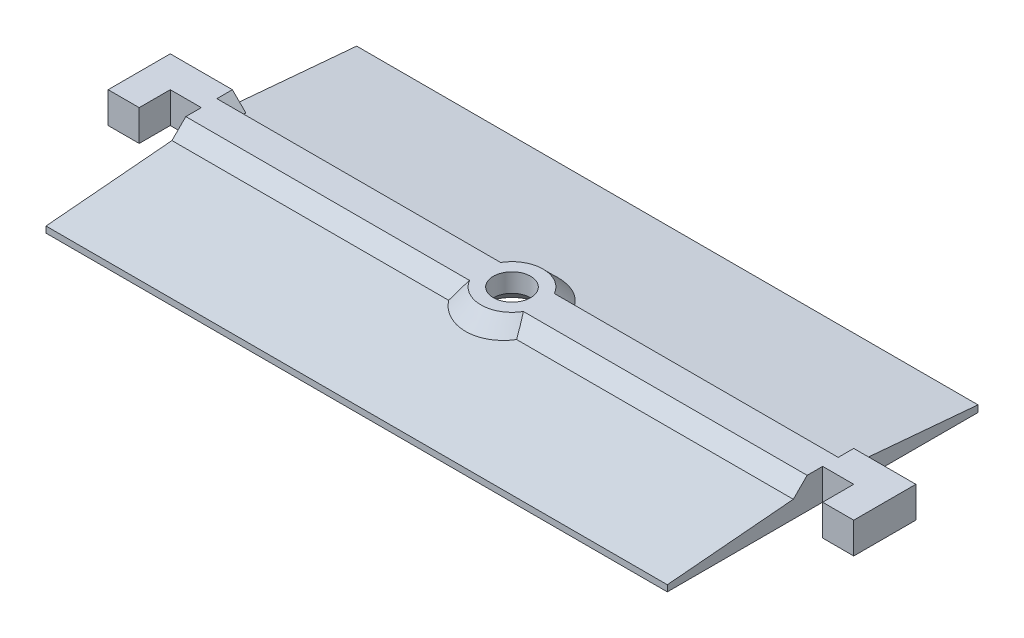
ISO-10303-21;
HEADER;
FILE_DESCRIPTION(('STEP AP214'),'2;1');
FILE_NAME('part.step','',(''),(''),'','','');
FILE_SCHEMA(('AUTOMOTIVE_DESIGN { 1 0 10303 214 1 1 1 1 }'));
ENDSEC;
DATA;
#1=APPLICATION_CONTEXT('core data for automotive mechanical design processes');
#2=APPLICATION_PROTOCOL_DEFINITION('international standard','automotive_design',2000,#1);
#3=PRODUCT_CONTEXT('',#1,'mechanical');
#4=PRODUCT('Part','Part','',(#3));
#5=PRODUCT_RELATED_PRODUCT_CATEGORY('part','',(#4));
#6=PRODUCT_DEFINITION_FORMATION('','',#4);
#7=PRODUCT_DEFINITION_CONTEXT('part definition',#1,'design');
#8=PRODUCT_DEFINITION('design','',#6,#7);
#9=PRODUCT_DEFINITION_SHAPE('','',#8);
#10=(LENGTH_UNIT() NAMED_UNIT(*) SI_UNIT(.MILLI.,.METRE.));
#11=(NAMED_UNIT(*) PLANE_ANGLE_UNIT() SI_UNIT($,.RADIAN.));
#12=(NAMED_UNIT(*) SI_UNIT($,.STERADIAN.) SOLID_ANGLE_UNIT());
#13=UNCERTAINTY_MEASURE_WITH_UNIT(LENGTH_MEASURE(1.E-05),#10,'distance_accuracy_value','');
#14=(GEOMETRIC_REPRESENTATION_CONTEXT(3) GLOBAL_UNCERTAINTY_ASSIGNED_CONTEXT((#13)) GLOBAL_UNIT_ASSIGNED_CONTEXT((#10,
#11,#12)) REPRESENTATION_CONTEXT('',''));
#15=CARTESIAN_POINT('',(0.,0.,0.));
#16=DIRECTION('',(0.,0.,1.));
#17=DIRECTION('',(1.,0.,0.));
#18=AXIS2_PLACEMENT_3D('',#15,#16,#17);
#19=CARTESIAN_POINT('',(-50.,3.,0.));
#20=DIRECTION('',(-1.,0.,0.));
#21=DIRECTION('',(0.,0.,1.));
#22=AXIS2_PLACEMENT_3D('',#19,#20,#21);
#23=PLANE('',#22);
#24=DIRECTION('',(0.,0.0871557427476554,-0.996194698091746));
#25=VECTOR('',#24,1.);
#26=CARTESIAN_POINT('',(-50.,3.18579446782419,0.0162549096804485));
#27=LINE('',#26,#25);
#28=CARTESIAN_POINT('',(-50.,0.99999999999984,25.));
#29=VERTEX_POINT('',#28);
#30=CARTESIAN_POINT('',(-50.,2.77372073149621,4.72627926850375));
#31=VERTEX_POINT('',#30);
#32=EDGE_CURVE('E547',#29,#31,#27,.T.);
#33=ORIENTED_EDGE('',*,*,#32,.T.);
#34=DIRECTION('',(0.,0.707106781186552,-0.707106781186543));
#35=VECTOR('',#34,1.);
#36=CARTESIAN_POINT('',(-50.,4.99999999999999,2.49999999999999));
#37=LINE('',#36,#35);
#38=CARTESIAN_POINT('',(-50.,5.,2.49999999999999));
#39=VERTEX_POINT('',#38);
#40=EDGE_CURVE('E439',#31,#39,#37,.T.);
#41=ORIENTED_EDGE('',*,*,#40,.T.);
#42=DIRECTION('',(0.,0.,-1.));
#43=VECTOR('',#42,1.);
#44=CARTESIAN_POINT('',(-50.,5.,0.));
#45=LINE('',#44,#43);
#46=CARTESIAN_POINT('',(-50.,5.,0.));
#47=VERTEX_POINT('',#46);
#48=EDGE_CURVE('E390',#39,#47,#45,.T.);
#49=ORIENTED_EDGE('',*,*,#48,.T.);
#50=DIRECTION('',(0.,-1.,0.));
#51=VECTOR('',#50,1.);
#52=CARTESIAN_POINT('',(-50.,5.,0.));
#53=LINE('',#52,#51);
#54=CARTESIAN_POINT('',(-50.,0.,0.));
#55=VERTEX_POINT('',#54);
#56=EDGE_CURVE('E395',#47,#55,#53,.T.);
#57=ORIENTED_EDGE('',*,*,#56,.T.);
#58=DIRECTION('',(0.,0.,-1.));
#59=VECTOR('',#58,1.);
#60=CARTESIAN_POINT('',(-50.,0.,0.));
#61=LINE('',#60,#59);
#62=CARTESIAN_POINT('',(-50.,0.,25.));
#63=VERTEX_POINT('',#62);
#64=EDGE_CURVE('E367',#63,#55,#61,.T.);
#65=ORIENTED_EDGE('',*,*,#64,.F.);
#66=DIRECTION('',(0.,-1.,0.));
#67=VECTOR('',#66,1.);
#68=CARTESIAN_POINT('',(-50.,3.,25.));
#69=LINE('',#68,#67);
#70=EDGE_CURVE('E431',#29,#63,#69,.T.);
#71=ORIENTED_EDGE('',*,*,#70,.F.);
#72=EDGE_LOOP('',(#33,#41,#49,#57,#65,#71));
#73=FACE_BOUND('',#72,.T.);
#74=ADVANCED_FACE('F105',(#73),#23,.T.);
#75=CARTESIAN_POINT('',(0.,3.,25.));
#76=DIRECTION('',(0.,0.,-1.));
#77=DIRECTION('',(-1.,0.,0.));
#78=AXIS2_PLACEMENT_3D('',#75,#76,#77);
#79=PLANE('',#78);
#80=DIRECTION('',(0.,-1.,0.));
#81=VECTOR('',#80,1.);
#82=CARTESIAN_POINT('',(50.,3.,25.));
#83=LINE('',#82,#81);
#84=CARTESIAN_POINT('',(50.,0.99999999999984,25.));
#85=VERTEX_POINT('',#84);
#86=CARTESIAN_POINT('',(50.,0.,25.));
#87=VERTEX_POINT('',#86);
#88=EDGE_CURVE('E429',#85,#87,#83,.T.);
#89=ORIENTED_EDGE('',*,*,#88,.F.);
#90=DIRECTION('',(-1.,0.,0.));
#91=VECTOR('',#90,1.);
#92=CARTESIAN_POINT('',(-50.,0.99999999999984,25.));
#93=LINE('',#92,#91);
#94=EDGE_CURVE('E544',#85,#29,#93,.T.);
#95=ORIENTED_EDGE('',*,*,#94,.T.);
#96=ORIENTED_EDGE('',*,*,#70,.T.);
#97=DIRECTION('',(1.,0.,0.));
#98=VECTOR('',#97,1.);
#99=CARTESIAN_POINT('',(0.,0.,25.));
#100=LINE('',#99,#98);
#101=EDGE_CURVE('E424',#63,#87,#100,.T.);
#102=ORIENTED_EDGE('',*,*,#101,.T.);
#103=EDGE_LOOP('',(#89,#95,#96,#102));
#104=FACE_BOUND('',#103,.T.);
#105=ADVANCED_FACE('F507',(#104),#79,.F.);
#106=CARTESIAN_POINT('',(50.,3.,0.));
#107=DIRECTION('',(-1.,0.,0.));
#108=DIRECTION('',(0.,0.,1.));
#109=AXIS2_PLACEMENT_3D('',#106,#107,#108);
#110=PLANE('',#109);
#111=DIRECTION('',(0.,-0.707106781186552,0.707106781186543));
#112=VECTOR('',#111,1.);
#113=CARTESIAN_POINT('',(50.,5.24999999999997,2.25));
#114=LINE('',#113,#112);
#115=CARTESIAN_POINT('',(50.,5.,2.49999999999998));
#116=VERTEX_POINT('',#115);
#117=CARTESIAN_POINT('',(50.,2.77372073149621,4.72627926850372));
#118=VERTEX_POINT('',#117);
#119=EDGE_CURVE('E437',#116,#118,#114,.T.);
#120=ORIENTED_EDGE('',*,*,#119,.T.);
#121=DIRECTION('',(0.,-0.0871557427476554,0.996194698091746));
#122=VECTOR('',#121,1.);
#123=CARTESIAN_POINT('',(50.,3.,2.13989539447477));
#124=LINE('',#123,#122);
#125=EDGE_CURVE('E539',#118,#85,#124,.T.);
#126=ORIENTED_EDGE('',*,*,#125,.T.);
#127=ORIENTED_EDGE('',*,*,#88,.T.);
#128=DIRECTION('',(0.,0.,-1.));
#129=VECTOR('',#128,1.);
#130=CARTESIAN_POINT('',(50.,0.,0.));
#131=LINE('',#130,#129);
#132=CARTESIAN_POINT('',(50.,0.,0.));
#133=VERTEX_POINT('',#132);
#134=EDGE_CURVE('E427',#87,#133,#131,.T.);
#135=ORIENTED_EDGE('',*,*,#134,.T.);
#136=DIRECTION('',(0.,-1.,0.));
#137=VECTOR('',#136,1.);
#138=CARTESIAN_POINT('',(50.,5.,0.));
#139=LINE('',#138,#137);
#140=CARTESIAN_POINT('',(50.,5.,0.));
#141=VERTEX_POINT('',#140);
#142=EDGE_CURVE('E341',#141,#133,#139,.T.);
#143=ORIENTED_EDGE('',*,*,#142,.F.);
#144=DIRECTION('',(0.,0.,-1.));
#145=VECTOR('',#144,1.);
#146=CARTESIAN_POINT('',(50.,5.,0.));
#147=LINE('',#146,#145);
#148=EDGE_CURVE('E339',#116,#141,#147,.T.);
#149=ORIENTED_EDGE('',*,*,#148,.F.);
#150=EDGE_LOOP('',(#120,#126,#127,#135,#143,#149));
#151=FACE_BOUND('',#150,.T.);
#152=ADVANCED_FACE('F513',(#151),#110,.F.);
#153=CARTESIAN_POINT('',(0.,0.,0.));
#154=DIRECTION('',(0.,1.,0.));
#155=DIRECTION('',(0.,0.,1.));
#156=AXIS2_PLACEMENT_3D('',#153,#154,#155);
#157=PLANE('',#156);
#158=CARTESIAN_POINT('',(0.,0.,0.));
#159=DIRECTION('',(0.,1.,0.));
#160=DIRECTION('',(0.,0.,1.));
#161=AXIS2_PLACEMENT_3D('',#158,#159,#160);
#162=CIRCLE('',#161,4.99999999999995);
#163=CARTESIAN_POINT('',(0.,0.,4.99999999999994));
#164=VERTEX_POINT('',#163);
#165=EDGE_CURVE('E113',#164,#164,#162,.T.);
#166=ORIENTED_EDGE('',*,*,#165,.T.);
#167=EDGE_LOOP('',(#166));
#168=FACE_BOUND('',#167,.T.);
#169=DIRECTION('',(0.,0.,-1.));
#170=VECTOR('',#169,1.);
#171=CARTESIAN_POINT('',(50.,0.,0.));
#172=LINE('',#171,#170);
#173=CARTESIAN_POINT('',(50.,0.,-5.00000000000001));
#174=VERTEX_POINT('',#173);
#175=CARTESIAN_POINT('',(50.,0.,-25.));
#176=VERTEX_POINT('',#175);
#177=EDGE_CURVE('E295',#174,#176,#172,.T.);
#178=ORIENTED_EDGE('',*,*,#177,.F.);
#179=DIRECTION('',(-1.,0.,0.));
#180=VECTOR('',#179,1.);
#181=CARTESIAN_POINT('',(0.,0.,-5.00000000000001));
#182=LINE('',#181,#180);
#183=CARTESIAN_POINT('',(60.,0.,-5.00000000000001));
#184=VERTEX_POINT('',#183);
#185=EDGE_CURVE('E321',#184,#174,#182,.T.);
#186=ORIENTED_EDGE('',*,*,#185,.F.);
#187=DIRECTION('',(0.,0.,-1.));
#188=VECTOR('',#187,1.);
#189=CARTESIAN_POINT('',(60.,0.,0.));
#190=LINE('',#189,#188);
#191=CARTESIAN_POINT('',(60.,0.,4.99999999999997));
#192=VERTEX_POINT('',#191);
#193=EDGE_CURVE('E350',#192,#184,#190,.T.);
#194=ORIENTED_EDGE('',*,*,#193,.F.);
#195=DIRECTION('',(1.,0.,0.));
#196=VECTOR('',#195,1.);
#197=CARTESIAN_POINT('',(0.,0.,4.99999999999996));
#198=LINE('',#197,#196);
#199=CARTESIAN_POINT('',(55.,0.,4.99999999999997));
#200=VERTEX_POINT('',#199);
#201=EDGE_CURVE('E348',#200,#192,#198,.T.);
#202=ORIENTED_EDGE('',*,*,#201,.F.);
#203=DIRECTION('',(0.,0.,1.));
#204=VECTOR('',#203,1.);
#205=CARTESIAN_POINT('',(55.,0.,0.));
#206=LINE('',#205,#204);
#207=CARTESIAN_POINT('',(55.,0.,0.));
#208=VERTEX_POINT('',#207);
#209=EDGE_CURVE('E345',#208,#200,#206,.T.);
#210=ORIENTED_EDGE('',*,*,#209,.F.);
#211=DIRECTION('',(1.,0.,0.));
#212=VECTOR('',#211,1.);
#213=CARTESIAN_POINT('',(0.,0.,0.));
#214=LINE('',#213,#212);
#215=EDGE_CURVE('E342',#133,#208,#214,.T.);
#216=ORIENTED_EDGE('',*,*,#215,.F.);
#217=ORIENTED_EDGE('',*,*,#134,.F.);
#218=ORIENTED_EDGE('',*,*,#101,.F.);
#219=ORIENTED_EDGE('',*,*,#64,.T.);
#220=DIRECTION('',(-1.,0.,0.));
#221=VECTOR('',#220,1.);
#222=CARTESIAN_POINT('',(0.,0.,0.));
#223=LINE('',#222,#221);
#224=CARTESIAN_POINT('',(-55.,0.,0.));
#225=VERTEX_POINT('',#224);
#226=EDGE_CURVE('E372',#55,#225,#223,.T.);
#227=ORIENTED_EDGE('',*,*,#226,.T.);
#228=DIRECTION('',(0.,0.,1.));
#229=VECTOR('',#228,1.);
#230=CARTESIAN_POINT('',(-55.,0.,0.));
#231=LINE('',#230,#229);
#232=CARTESIAN_POINT('',(-55.,0.,5.));
#233=VERTEX_POINT('',#232);
#234=EDGE_CURVE('E405',#225,#233,#231,.T.);
#235=ORIENTED_EDGE('',*,*,#234,.T.);
#236=DIRECTION('',(-1.,0.,0.));
#237=VECTOR('',#236,1.);
#238=CARTESIAN_POINT('',(0.,0.,4.99999999999999));
#239=LINE('',#238,#237);
#240=CARTESIAN_POINT('',(-60.,0.,5.));
#241=VERTEX_POINT('',#240);
#242=EDGE_CURVE('E402',#233,#241,#239,.T.);
#243=ORIENTED_EDGE('',*,*,#242,.T.);
#244=DIRECTION('',(0.,0.,-1.));
#245=VECTOR('',#244,1.);
#246=CARTESIAN_POINT('',(-60.,0.,0.));
#247=LINE('',#246,#245);
#248=CARTESIAN_POINT('',(-60.,0.,-5.));
#249=VERTEX_POINT('',#248);
#250=EDGE_CURVE('E398',#241,#249,#247,.T.);
#251=ORIENTED_EDGE('',*,*,#250,.T.);
#252=DIRECTION('',(1.,0.,0.));
#253=VECTOR('',#252,1.);
#254=CARTESIAN_POINT('',(0.,0.,-5.));
#255=LINE('',#254,#253);
#256=CARTESIAN_POINT('',(-50.,0.,-5.));
#257=VERTEX_POINT('',#256);
#258=EDGE_CURVE('E396',#249,#257,#255,.T.);
#259=ORIENTED_EDGE('',*,*,#258,.T.);
#260=DIRECTION('',(0.,0.,-1.));
#261=VECTOR('',#260,1.);
#262=CARTESIAN_POINT('',(-50.,0.,0.));
#263=LINE('',#262,#261);
#264=CARTESIAN_POINT('',(-50.,0.,-25.));
#265=VERTEX_POINT('',#264);
#266=EDGE_CURVE('E308',#257,#265,#263,.T.);
#267=ORIENTED_EDGE('',*,*,#266,.T.);
#268=DIRECTION('',(1.,0.,0.));
#269=VECTOR('',#268,1.);
#270=CARTESIAN_POINT('',(0.,0.,-25.));
#271=LINE('',#270,#269);
#272=EDGE_CURVE('E287',#265,#176,#271,.T.);
#273=ORIENTED_EDGE('',*,*,#272,.T.);
#274=EDGE_LOOP('',(#178,#186,#194,#202,#210,#216,#217,#218,#219,#227,#235,#243,#251,#259,#267,#273));
#275=FACE_BOUND('',#274,.T.);
#276=ADVANCED_FACE('F305',(#168,#275),#157,.F.);
#277=CARTESIAN_POINT('',(55.,5.,0.));
#278=DIRECTION('',(1.,0.,0.));
#279=DIRECTION('',(0.,0.,-1.));
#280=AXIS2_PLACEMENT_3D('',#277,#278,#279);
#281=PLANE('',#280);
#282=ORIENTED_EDGE('',*,*,#209,.T.);
#283=DIRECTION('',(0.,-1.,0.));
#284=VECTOR('',#283,1.);
#285=CARTESIAN_POINT('',(55.,5.,4.99999999999997));
#286=LINE('',#285,#284);
#287=CARTESIAN_POINT('',(55.,5.,4.99999999999997));
#288=VERTEX_POINT('',#287);
#289=EDGE_CURVE('E361',#288,#200,#286,.T.);
#290=ORIENTED_EDGE('',*,*,#289,.F.);
#291=DIRECTION('',(0.,0.,1.));
#292=VECTOR('',#291,1.);
#293=CARTESIAN_POINT('',(55.,5.,0.));
#294=LINE('',#293,#292);
#295=CARTESIAN_POINT('',(55.,5.,0.));
#296=VERTEX_POINT('',#295);
#297=EDGE_CURVE('E320',#296,#288,#294,.T.);
#298=ORIENTED_EDGE('',*,*,#297,.F.);
#299=DIRECTION('',(0.,-1.,0.));
#300=VECTOR('',#299,1.);
#301=CARTESIAN_POINT('',(55.,5.,0.));
#302=LINE('',#301,#300);
#303=EDGE_CURVE('E364',#296,#208,#302,.T.);
#304=ORIENTED_EDGE('',*,*,#303,.T.);
#305=EDGE_LOOP('',(#282,#290,#298,#304));
#306=FACE_BOUND('',#305,.T.);
#307=ADVANCED_FACE('F559',(#306),#281,.F.);
#308=CARTESIAN_POINT('',(0.,5.,4.99999999999996));
#309=DIRECTION('',(0.,0.,-1.));
#310=DIRECTION('',(-1.,0.,0.));
#311=AXIS2_PLACEMENT_3D('',#308,#309,#310);
#312=PLANE('',#311);
#313=ORIENTED_EDGE('',*,*,#201,.T.);
#314=DIRECTION('',(0.,-1.,0.));
#315=VECTOR('',#314,1.);
#316=CARTESIAN_POINT('',(60.,5.,4.99999999999997));
#317=LINE('',#316,#315);
#318=CARTESIAN_POINT('',(60.,5.,4.99999999999997));
#319=VERTEX_POINT('',#318);
#320=EDGE_CURVE('E358',#319,#192,#317,.T.);
#321=ORIENTED_EDGE('',*,*,#320,.F.);
#322=DIRECTION('',(1.,0.,0.));
#323=VECTOR('',#322,1.);
#324=CARTESIAN_POINT('',(0.,5.,4.99999999999996));
#325=LINE('',#324,#323);
#326=EDGE_CURVE('E323',#288,#319,#325,.T.);
#327=ORIENTED_EDGE('',*,*,#326,.F.);
#328=ORIENTED_EDGE('',*,*,#289,.T.);
#329=EDGE_LOOP('',(#313,#321,#327,#328));
#330=FACE_BOUND('',#329,.T.);
#331=ADVANCED_FACE('F565',(#330),#312,.F.);
#332=CARTESIAN_POINT('',(60.,5.,0.));
#333=DIRECTION('',(-1.,0.,0.));
#334=DIRECTION('',(0.,0.,1.));
#335=AXIS2_PLACEMENT_3D('',#332,#333,#334);
#336=PLANE('',#335);
#337=ORIENTED_EDGE('',*,*,#193,.T.);
#338=DIRECTION('',(0.,-1.,0.));
#339=VECTOR('',#338,1.);
#340=CARTESIAN_POINT('',(60.,5.,-5.00000000000001));
#341=LINE('',#340,#339);
#342=CARTESIAN_POINT('',(60.,5.,-5.00000000000001));
#343=VERTEX_POINT('',#342);
#344=EDGE_CURVE('E355',#343,#184,#341,.T.);
#345=ORIENTED_EDGE('',*,*,#344,.F.);
#346=DIRECTION('',(0.,0.,-1.));
#347=VECTOR('',#346,1.);
#348=CARTESIAN_POINT('',(60.,5.,0.));
#349=LINE('',#348,#347);
#350=EDGE_CURVE('E325',#319,#343,#349,.T.);
#351=ORIENTED_EDGE('',*,*,#350,.F.);
#352=ORIENTED_EDGE('',*,*,#320,.T.);
#353=EDGE_LOOP('',(#337,#345,#351,#352));
#354=FACE_BOUND('',#353,.T.);
#355=ADVANCED_FACE('F602',(#354),#336,.F.);
#356=CARTESIAN_POINT('',(0.,5.,-5.00000000000001));
#357=DIRECTION('',(0.,0.,1.));
#358=DIRECTION('',(1.,0.,0.));
#359=AXIS2_PLACEMENT_3D('',#356,#357,#358);
#360=PLANE('',#359);
#361=ORIENTED_EDGE('',*,*,#185,.T.);
#362=DIRECTION('',(0.,-1.,0.));
#363=VECTOR('',#362,1.);
#364=CARTESIAN_POINT('',(50.,5.,-5.00000000000001));
#365=LINE('',#364,#363);
#366=CARTESIAN_POINT('',(50.,2.82502267294813,-5.00000000000001));
#367=VERTEX_POINT('',#366);
#368=EDGE_CURVE('E298',#367,#174,#365,.T.);
#369=ORIENTED_EDGE('',*,*,#368,.F.);
#370=DIRECTION('',(1.,0.,0.));
#371=VECTOR('',#370,1.);
#372=CARTESIAN_POINT('',(0.,2.82502267294813,-5.00000000000001));
#373=LINE('',#372,#371);
#374=CARTESIAN_POINT('',(47.8250226729481,2.82502267294814,-5.00000000000001));
#375=VERTEX_POINT('',#374);
#376=EDGE_CURVE('E623',#367,#375,#373,.F.);
#377=ORIENTED_EDGE('',*,*,#376,.T.);
#378=DIRECTION('',(-0.70710678118655,-0.707106781186545,0.));
#379=VECTOR('',#378,1.);
#380=CARTESIAN_POINT('',(24.9999999999998,-20.,-5.00000000000001));
#381=LINE('',#380,#379);
#382=CARTESIAN_POINT('',(50.,5.,-5.00000000000001));
#383=VERTEX_POINT('',#382);
#384=EDGE_CURVE('E435',#375,#383,#381,.F.);
#385=ORIENTED_EDGE('',*,*,#384,.T.);
#386=DIRECTION('',(-1.,0.,0.));
#387=VECTOR('',#386,1.);
#388=CARTESIAN_POINT('',(0.,5.,-5.00000000000001));
#389=LINE('',#388,#387);
#390=EDGE_CURVE('E327',#343,#383,#389,.T.);
#391=ORIENTED_EDGE('',*,*,#390,.F.);
#392=ORIENTED_EDGE('',*,*,#344,.T.);
#393=EDGE_LOOP('',(#361,#369,#377,#385,#391,#392));
#394=FACE_BOUND('',#393,.T.);
#395=ADVANCED_FACE('F597',(#394),#360,.F.);
#396=CARTESIAN_POINT('',(0.,5.,0.));
#397=DIRECTION('',(0.,0.,-1.));
#398=DIRECTION('',(-1.,0.,0.));
#399=AXIS2_PLACEMENT_3D('',#396,#397,#398);
#400=PLANE('',#399);
#401=ORIENTED_EDGE('',*,*,#215,.T.);
#402=ORIENTED_EDGE('',*,*,#303,.F.);
#403=DIRECTION('',(1.,0.,0.));
#404=VECTOR('',#403,1.);
#405=CARTESIAN_POINT('',(0.,5.,0.));
#406=LINE('',#405,#404);
#407=EDGE_CURVE('E317',#141,#296,#406,.T.);
#408=ORIENTED_EDGE('',*,*,#407,.F.);
#409=ORIENTED_EDGE('',*,*,#142,.T.);
#410=EDGE_LOOP('',(#401,#402,#408,#409));
#411=FACE_BOUND('',#410,.T.);
#412=ADVANCED_FACE('F595',(#411),#400,.F.);
#413=CARTESIAN_POINT('',(0.,5.,0.));
#414=DIRECTION('',(0.,1.,0.));
#415=DIRECTION('',(0.,0.,1.));
#416=AXIS2_PLACEMENT_3D('',#413,#414,#415);
#417=PLANE('',#416);
#418=ORIENTED_EDGE('',*,*,#407,.T.);
#419=ORIENTED_EDGE('',*,*,#297,.T.);
#420=ORIENTED_EDGE('',*,*,#326,.T.);
#421=ORIENTED_EDGE('',*,*,#350,.T.);
#422=ORIENTED_EDGE('',*,*,#390,.T.);
#423=DIRECTION('',(0.,0.,-1.));
#424=VECTOR('',#423,1.);
#425=CARTESIAN_POINT('',(50.,5.,0.));
#426=LINE('',#425,#424);
#427=CARTESIAN_POINT('',(50.,5.,-2.50000000000002));
#428=VERTEX_POINT('',#427);
#429=EDGE_CURVE('E330',#428,#383,#426,.T.);
#430=ORIENTED_EDGE('',*,*,#429,.F.);
#431=DIRECTION('',(1.,0.,0.));
#432=VECTOR('',#431,1.);
#433=CARTESIAN_POINT('',(0.,5.,-2.50000000000002));
#434=LINE('',#433,#432);
#435=CARTESIAN_POINT('',(4.33012701892217,5.,-2.50000000000002));
#436=VERTEX_POINT('',#435);
#437=EDGE_CURVE('E333',#436,#428,#434,.T.);
#438=ORIENTED_EDGE('',*,*,#437,.F.);
#439=CARTESIAN_POINT('',(0.,5.,0.));
#440=DIRECTION('',(0.,1.,0.));
#441=DIRECTION('',(0.,0.,1.));
#442=AXIS2_PLACEMENT_3D('',#439,#440,#441);
#443=CIRCLE('',#442,5.);
#444=CARTESIAN_POINT('',(-4.33012701892221,5.,-2.50000000000001));
#445=VERTEX_POINT('',#444);
#446=EDGE_CURVE('E421',#436,#445,#443,.T.);
#447=ORIENTED_EDGE('',*,*,#446,.T.);
#448=DIRECTION('',(1.,0.,0.));
#449=VECTOR('',#448,1.);
#450=CARTESIAN_POINT('',(0.,5.,-2.50000000000001));
#451=LINE('',#450,#449);
#452=CARTESIAN_POINT('',(-50.,5.,-2.50000000000001));
#453=VERTEX_POINT('',#452);
#454=EDGE_CURVE('E368',#453,#445,#451,.T.);
#455=ORIENTED_EDGE('',*,*,#454,.F.);
#456=DIRECTION('',(0.,0.,-1.));
#457=VECTOR('',#456,1.);
#458=CARTESIAN_POINT('',(-50.,5.,0.));
#459=LINE('',#458,#457);
#460=CARTESIAN_POINT('',(-50.,5.,-5.));
#461=VERTEX_POINT('',#460);
#462=EDGE_CURVE('E371',#453,#461,#459,.T.);
#463=ORIENTED_EDGE('',*,*,#462,.T.);
#464=DIRECTION('',(1.,0.,0.));
#465=VECTOR('',#464,1.);
#466=CARTESIAN_POINT('',(0.,5.,-5.));
#467=LINE('',#466,#465);
#468=CARTESIAN_POINT('',(-60.,5.,-5.));
#469=VERTEX_POINT('',#468);
#470=EDGE_CURVE('E375',#469,#461,#467,.T.);
#471=ORIENTED_EDGE('',*,*,#470,.F.);
#472=DIRECTION('',(0.,0.,-1.));
#473=VECTOR('',#472,1.);
#474=CARTESIAN_POINT('',(-60.,5.,0.));
#475=LINE('',#474,#473);
#476=CARTESIAN_POINT('',(-60.,5.,5.));
#477=VERTEX_POINT('',#476);
#478=EDGE_CURVE('E378',#477,#469,#475,.T.);
#479=ORIENTED_EDGE('',*,*,#478,.F.);
#480=DIRECTION('',(-1.,0.,0.));
#481=VECTOR('',#480,1.);
#482=CARTESIAN_POINT('',(0.,5.,4.99999999999999));
#483=LINE('',#482,#481);
#484=CARTESIAN_POINT('',(-55.,5.,5.));
#485=VERTEX_POINT('',#484);
#486=EDGE_CURVE('E381',#485,#477,#483,.T.);
#487=ORIENTED_EDGE('',*,*,#486,.F.);
#488=DIRECTION('',(0.,0.,1.));
#489=VECTOR('',#488,1.);
#490=CARTESIAN_POINT('',(-55.,5.,0.));
#491=LINE('',#490,#489);
#492=CARTESIAN_POINT('',(-55.,5.,0.));
#493=VERTEX_POINT('',#492);
#494=EDGE_CURVE('E384',#493,#485,#491,.T.);
#495=ORIENTED_EDGE('',*,*,#494,.F.);
#496=DIRECTION('',(-1.,0.,0.));
#497=VECTOR('',#496,1.);
#498=CARTESIAN_POINT('',(0.,5.,0.));
#499=LINE('',#498,#497);
#500=EDGE_CURVE('E387',#47,#493,#499,.T.);
#501=ORIENTED_EDGE('',*,*,#500,.F.);
#502=ORIENTED_EDGE('',*,*,#48,.F.);
#503=DIRECTION('',(1.,0.,0.));
#504=VECTOR('',#503,1.);
#505=CARTESIAN_POINT('',(0.,5.,2.49999999999999));
#506=LINE('',#505,#504);
#507=CARTESIAN_POINT('',(-4.33012701892221,5.,2.49999999999999));
#508=VERTEX_POINT('',#507);
#509=EDGE_CURVE('E393',#39,#508,#506,.T.);
#510=ORIENTED_EDGE('',*,*,#509,.T.);
#511=CARTESIAN_POINT('',(4.33012701892218,5.,2.49999999999998));
#512=VERTEX_POINT('',#511);
#513=EDGE_CURVE('E399',#508,#512,#443,.T.);
#514=ORIENTED_EDGE('',*,*,#513,.T.);
#515=DIRECTION('',(1.,0.,0.));
#516=VECTOR('',#515,1.);
#517=CARTESIAN_POINT('',(0.,5.,2.49999999999998));
#518=LINE('',#517,#516);
#519=EDGE_CURVE('E336',#512,#116,#518,.T.);
#520=ORIENTED_EDGE('',*,*,#519,.T.);
#521=ORIENTED_EDGE('',*,*,#148,.T.);
#522=EDGE_LOOP('',(#418,#419,#420,#421,#422,#430,#438,#447,#455,#463,#471,#479,#487,#495,#501,
#502,#510,#514,#520,#521));
#523=FACE_BOUND('',#522,.T.);
#524=CARTESIAN_POINT('',(0.,5.,0.));
#525=DIRECTION('',(0.,1.,0.));
#526=DIRECTION('',(0.,0.,1.));
#527=AXIS2_PLACEMENT_3D('',#524,#525,#526);
#528=CIRCLE('',#527,3.);
#529=CARTESIAN_POINT('',(0.,5.,2.99999999999999));
#530=VERTEX_POINT('',#529);
#531=EDGE_CURVE('E316',#530,#530,#528,.T.);
#532=ORIENTED_EDGE('',*,*,#531,.F.);
#533=EDGE_LOOP('',(#532));
#534=FACE_BOUND('',#533,.T.);
#535=ADVANCED_FACE('F579',(#523,#534),#417,.T.);
#536=CARTESIAN_POINT('',(0.,5.,-5.));
#537=DIRECTION('',(0.,0.,-1.));
#538=DIRECTION('',(-1.,0.,0.));
#539=AXIS2_PLACEMENT_3D('',#536,#537,#538);
#540=PLANE('',#539);
#541=ORIENTED_EDGE('',*,*,#258,.F.);
#542=DIRECTION('',(0.,-1.,0.));
#543=VECTOR('',#542,1.);
#544=CARTESIAN_POINT('',(-60.,5.,-5.));
#545=LINE('',#544,#543);
#546=EDGE_CURVE('E346',#469,#249,#545,.T.);
#547=ORIENTED_EDGE('',*,*,#546,.F.);
#548=ORIENTED_EDGE('',*,*,#470,.T.);
#549=DIRECTION('',(0.70710678118655,-0.707106781186545,0.));
#550=VECTOR('',#549,1.);
#551=CARTESIAN_POINT('',(-50.,5.,-5.));
#552=LINE('',#551,#550);
#553=CARTESIAN_POINT('',(-47.8250226729481,2.82502267294814,-5.));
#554=VERTEX_POINT('',#553);
#555=EDGE_CURVE('E433',#461,#554,#552,.T.);
#556=ORIENTED_EDGE('',*,*,#555,.T.);
#557=DIRECTION('',(1.,0.,0.));
#558=VECTOR('',#557,1.);
#559=CARTESIAN_POINT('',(0.,2.82502267294814,-5.));
#560=LINE('',#559,#558);
#561=CARTESIAN_POINT('',(-50.,2.82502267294814,-5.));
#562=VERTEX_POINT('',#561);
#563=EDGE_CURVE('E537',#554,#562,#560,.F.);
#564=ORIENTED_EDGE('',*,*,#563,.T.);
#565=DIRECTION('',(0.,1.,0.));
#566=VECTOR('',#565,1.);
#567=CARTESIAN_POINT('',(-50.,5.,-5.));
#568=LINE('',#567,#566);
#569=EDGE_CURVE('E291',#257,#562,#568,.T.);
#570=ORIENTED_EDGE('',*,*,#569,.F.);
#571=EDGE_LOOP('',(#541,#547,#548,#556,#564,#570));
#572=FACE_BOUND('',#571,.T.);
#573=ADVANCED_FACE('F575',(#572),#540,.T.);
#574=CARTESIAN_POINT('',(-60.,5.,0.));
#575=DIRECTION('',(-1.,0.,0.));
#576=DIRECTION('',(0.,0.,1.));
#577=AXIS2_PLACEMENT_3D('',#574,#575,#576);
#578=PLANE('',#577);
#579=ORIENTED_EDGE('',*,*,#250,.F.);
#580=DIRECTION('',(0.,-1.,0.));
#581=VECTOR('',#580,1.);
#582=CARTESIAN_POINT('',(-60.,5.,5.));
#583=LINE('',#582,#581);
#584=EDGE_CURVE('E416',#477,#241,#583,.T.);
#585=ORIENTED_EDGE('',*,*,#584,.F.);
#586=ORIENTED_EDGE('',*,*,#478,.T.);
#587=ORIENTED_EDGE('',*,*,#546,.T.);
#588=EDGE_LOOP('',(#579,#585,#586,#587));
#589=FACE_BOUND('',#588,.T.);
#590=ADVANCED_FACE('F578',(#589),#578,.T.);
#591=CARTESIAN_POINT('',(0.,5.,4.99999999999999));
#592=DIRECTION('',(0.,0.,1.));
#593=DIRECTION('',(1.,0.,0.));
#594=AXIS2_PLACEMENT_3D('',#591,#592,#593);
#595=PLANE('',#594);
#596=ORIENTED_EDGE('',*,*,#242,.F.);
#597=DIRECTION('',(0.,-1.,0.));
#598=VECTOR('',#597,1.);
#599=CARTESIAN_POINT('',(-55.,5.,5.));
#600=LINE('',#599,#598);
#601=EDGE_CURVE('E414',#485,#233,#600,.T.);
#602=ORIENTED_EDGE('',*,*,#601,.F.);
#603=ORIENTED_EDGE('',*,*,#486,.T.);
#604=ORIENTED_EDGE('',*,*,#584,.T.);
#605=EDGE_LOOP('',(#596,#602,#603,#604));
#606=FACE_BOUND('',#605,.T.);
#607=ADVANCED_FACE('F583',(#606),#595,.T.);
#608=CARTESIAN_POINT('',(-55.,5.,0.));
#609=DIRECTION('',(1.,0.,0.));
#610=DIRECTION('',(0.,0.,-1.));
#611=AXIS2_PLACEMENT_3D('',#608,#609,#610);
#612=PLANE('',#611);
#613=ORIENTED_EDGE('',*,*,#234,.F.);
#614=DIRECTION('',(0.,-1.,0.));
#615=VECTOR('',#614,1.);
#616=CARTESIAN_POINT('',(-55.,5.,0.));
#617=LINE('',#616,#615);
#618=EDGE_CURVE('E412',#493,#225,#617,.T.);
#619=ORIENTED_EDGE('',*,*,#618,.F.);
#620=ORIENTED_EDGE('',*,*,#494,.T.);
#621=ORIENTED_EDGE('',*,*,#601,.T.);
#622=EDGE_LOOP('',(#613,#619,#620,#621));
#623=FACE_BOUND('',#622,.T.);
#624=ADVANCED_FACE('F587',(#623),#612,.T.);
#625=CARTESIAN_POINT('',(0.,5.,0.));
#626=DIRECTION('',(0.,0.,1.));
#627=DIRECTION('',(1.,0.,0.));
#628=AXIS2_PLACEMENT_3D('',#625,#626,#627);
#629=PLANE('',#628);
#630=ORIENTED_EDGE('',*,*,#226,.F.);
#631=ORIENTED_EDGE('',*,*,#56,.F.);
#632=ORIENTED_EDGE('',*,*,#500,.T.);
#633=ORIENTED_EDGE('',*,*,#618,.T.);
#634=EDGE_LOOP('',(#630,#631,#632,#633));
#635=FACE_BOUND('',#634,.T.);
#636=ADVANCED_FACE('F573',(#635),#629,.T.);
#637=CARTESIAN_POINT('',(0.,5.,0.));
#638=DIRECTION('',(0.,-1.,0.));
#639=DIRECTION('',(0.,0.,-1.));
#640=AXIS2_PLACEMENT_3D('',#637,#638,#639);
#641=CYLINDRICAL_SURFACE('',#640,3.);
#642=CARTESIAN_POINT('',(0.,1.99999999999997,0.));
#643=DIRECTION('',(0.,1.,0.));
#644=DIRECTION('',(0.,0.,1.));
#645=AXIS2_PLACEMENT_3D('',#642,#643,#644);
#646=CIRCLE('',#645,3.);
#647=CARTESIAN_POINT('',(0.,1.99999999999997,2.99999999999999));
#648=VERTEX_POINT('',#647);
#649=EDGE_CURVE('E12',#648,#648,#646,.F.);
#650=ORIENTED_EDGE('',*,*,#649,.T.);
#651=EDGE_LOOP('',(#650));
#652=FACE_BOUND('',#651,.T.);
#653=ORIENTED_EDGE('',*,*,#531,.T.);
#654=EDGE_LOOP('',(#653));
#655=FACE_BOUND('',#654,.T.);
#656=ADVANCED_FACE('F571',(#652,#655),#641,.F.);
#657=CARTESIAN_POINT('',(50.,3.,0.));
#658=DIRECTION('',(-1.,0.,0.));
#659=DIRECTION('',(0.,0.,1.));
#660=AXIS2_PLACEMENT_3D('',#657,#658,#659);
#661=PLANE('',#660);
#662=DIRECTION('',(0.,-1.,0.));
#663=VECTOR('',#662,1.);
#664=CARTESIAN_POINT('',(50.,3.,-25.));
#665=LINE('',#664,#663);
#666=CARTESIAN_POINT('',(50.,1.07524940242949,-25.));
#667=VERTEX_POINT('',#666);
#668=EDGE_CURVE('E282',#667,#176,#665,.T.);
#669=ORIENTED_EDGE('',*,*,#668,.F.);
#670=DIRECTION('',(0.,-0.0871557427476662,-0.996194698091745));
#671=VECTOR('',#670,1.);
#672=CARTESIAN_POINT('',(50.,1.07524940242949,-25.));
#673=LINE('',#672,#671);
#674=EDGE_CURVE('E624',#667,#367,#673,.F.);
#675=ORIENTED_EDGE('',*,*,#674,.T.);
#676=ORIENTED_EDGE('',*,*,#368,.T.);
#677=ORIENTED_EDGE('',*,*,#177,.T.);
#678=EDGE_LOOP('',(#669,#675,#676,#677));
#679=FACE_BOUND('',#678,.T.);
#680=ADVANCED_FACE('F296',(#679),#661,.F.);
#681=CARTESIAN_POINT('',(0.,3.,-25.));
#682=DIRECTION('',(0.,0.,-1.));
#683=DIRECTION('',(-1.,0.,0.));
#684=AXIS2_PLACEMENT_3D('',#681,#682,#683);
#685=PLANE('',#684);
#686=DIRECTION('',(0.,-1.,0.));
#687=VECTOR('',#686,1.);
#688=CARTESIAN_POINT('',(-50.,3.,-25.));
#689=LINE('',#688,#687);
#690=CARTESIAN_POINT('',(-50.,1.07524940242949,-25.));
#691=VERTEX_POINT('',#690);
#692=EDGE_CURVE('E292',#691,#265,#689,.T.);
#693=ORIENTED_EDGE('',*,*,#692,.F.);
#694=DIRECTION('',(1.,0.,0.));
#695=VECTOR('',#694,1.);
#696=CARTESIAN_POINT('',(0.,1.07524940242949,-25.));
#697=LINE('',#696,#695);
#698=EDGE_CURVE('E289',#691,#667,#697,.T.);
#699=ORIENTED_EDGE('',*,*,#698,.T.);
#700=ORIENTED_EDGE('',*,*,#668,.T.);
#701=ORIENTED_EDGE('',*,*,#272,.F.);
#702=EDGE_LOOP('',(#693,#699,#700,#701));
#703=FACE_BOUND('',#702,.T.);
#704=ADVANCED_FACE('F285',(#703),#685,.T.);
#705=CARTESIAN_POINT('',(-50.,3.,0.));
#706=DIRECTION('',(-1.,0.,0.));
#707=DIRECTION('',(0.,0.,1.));
#708=AXIS2_PLACEMENT_3D('',#705,#706,#707);
#709=PLANE('',#708);
#710=ORIENTED_EDGE('',*,*,#569,.T.);
#711=DIRECTION('',(0.,0.0871557427476662,0.996194698091745));
#712=VECTOR('',#711,1.);
#713=CARTESIAN_POINT('',(-50.,3.26047226650042,-0.022788370481692));
#714=LINE('',#713,#712);
#715=EDGE_CURVE('E621',#562,#691,#714,.F.);
#716=ORIENTED_EDGE('',*,*,#715,.T.);
#717=ORIENTED_EDGE('',*,*,#692,.T.);
#718=ORIENTED_EDGE('',*,*,#266,.F.);
#719=EDGE_LOOP('',(#710,#716,#717,#718));
#720=FACE_BOUND('',#719,.T.);
#721=ADVANCED_FACE('F472',(#720),#709,.T.);
#722=CARTESIAN_POINT('',(48.,3.,0.));
#723=DIRECTION('',(-0.707106781186545,0.70710678118655,0.));
#724=DIRECTION('',(0.,0.,1.));
#725=AXIS2_PLACEMENT_3D('',#722,#723,#724);
#726=PLANE('',#725);
#727=ORIENTED_EDGE('',*,*,#384,.F.);
#728=DIRECTION('',(0.0868265938642561,0.0868265938642555,0.992432509138966));
#729=VECTOR('',#728,1.);
#730=CARTESIAN_POINT('',(48.2585086032261,3.25850860322608,-0.0452331444124104));
#731=LINE('',#730,#729);
#732=CARTESIAN_POINT('',(47.8561848055543,2.85618480555432,-4.64381519444572));
#733=VERTEX_POINT('',#732);
#734=EDGE_CURVE('E627',#375,#733,#731,.T.);
#735=ORIENTED_EDGE('',*,*,#734,.T.);
#736=DIRECTION('',(-0.577350269189627,-0.577350269189623,-0.577350269189627));
#737=VECTOR('',#736,1.);
#738=CARTESIAN_POINT('',(49.5,4.50000000000001,-3.00000000000002));
#739=LINE('',#738,#737);
#740=EDGE_CURVE('E302',#428,#733,#739,.T.);
#741=ORIENTED_EDGE('',*,*,#740,.F.);
#742=ORIENTED_EDGE('',*,*,#429,.T.);
#743=EDGE_LOOP('',(#727,#735,#741,#742));
#744=FACE_BOUND('',#743,.T.);
#745=ADVANCED_FACE('F468',(#744),#726,.T.);
#746=CARTESIAN_POINT('',(0.,3.,-4.50000000000003));
#747=DIRECTION('',(0.,0.70710678118655,-0.707106781186545));
#748=DIRECTION('',(-1.,0.,0.));
#749=AXIS2_PLACEMENT_3D('',#746,#747,#748);
#750=PLANE('',#749);
#751=ORIENTED_EDGE('',*,*,#740,.T.);
#752=DIRECTION('',(-1.,0.,0.));
#753=VECTOR('',#752,1.);
#754=CARTESIAN_POINT('',(0.,2.85618480555432,-4.64381519444571));
#755=LINE('',#754,#753);
#756=CARTESIAN_POINT('',(5.42854271165183,2.85618480555432,-4.64381519444571));
#757=VERTEX_POINT('',#756);
#758=EDGE_CURVE('E632',#733,#757,#755,.T.);
#759=ORIENTED_EDGE('',*,*,#758,.T.);
#760=CARTESIAN_POINT('',(4.33012701892217,5.,-2.50000000000002));
#761=CARTESIAN_POINT('',(4.42497682329237,4.83565192605786,-2.66434807394216));
#762=CARTESIAN_POINT('',(4.51721127091756,4.67056111304797,-2.82943888695205));
#763=CARTESIAN_POINT('',(4.69706936150202,4.33914213337776,-3.16085786662227));
#764=CARTESIAN_POINT('',(4.78469338010013,4.17281406878786,-3.32718593121216));
#765=CARTESIAN_POINT('',(4.9559227410857,3.83922569213473,-3.66077430786529));
#766=CARTESIAN_POINT('',(5.03953008180506,3.67196589082479,-3.82803410917524));
#767=CARTESIAN_POINT('',(5.20324447903613,3.33659103943979,-4.16340896056024));
#768=CARTESIAN_POINT('',(5.28335150545675,3.16847598202624,-4.33152401797379));
#769=CARTESIAN_POINT('',(5.38424032982533,2.95209028292093,-4.54790971707911));
#770=CARTESIAN_POINT('',(5.40645219258997,2.90415137895876,-4.59584862104127));
#771=CARTESIAN_POINT('',(5.42854271165183,2.85618480555432,-4.64381519444571));
#772=B_SPLINE_CURVE_WITH_KNOTS('',3,(#760,#761,#762,#763,#764,#765,#766,#767,#768,#769,#770,
#771),.UNSPECIFIED.,.F.,.F.,(4,2,2,2,2,4),(0.,0.753057515475236,1.50605357960224,
2.25867105770055,3.01129500453778,3.22531957899785),.UNSPECIFIED.);
#773=EDGE_CURVE('E450',#436,#757,#772,.T.);
#774=ORIENTED_EDGE('',*,*,#773,.F.);
#775=ORIENTED_EDGE('',*,*,#437,.T.);
#776=EDGE_LOOP('',(#751,#759,#774,#775));
#777=FACE_BOUND('',#776,.T.);
#778=ADVANCED_FACE('F464',(#777),#750,.T.);
#779=CARTESIAN_POINT('',(0.,5.,0.));
#780=DIRECTION('',(0.,-1.,0.));
#781=DIRECTION('',(0.,0.,-1.));
#782=AXIS2_PLACEMENT_3D('',#779,#780,#781);
#783=CONICAL_SURFACE('',#782,5.,0.785398163397452);
#784=ORIENTED_EDGE('',*,*,#773,.T.);
#785=CARTESIAN_POINT('',(0.,3.2104973294626,-0.59400451465108));
#786=DIRECTION('',(0.,-0.996194698091745,0.0871557427476662));
#787=DIRECTION('',(0.,-0.0871557427476662,-0.996194698091745));
#788=AXIS2_PLACEMENT_3D('',#785,#786,#787);
#789=ELLIPSE('',#788,6.81543746773899,6.76346842602291);
#790=CARTESIAN_POINT('',(-5.42854271165187,2.85618480555432,-4.64381519444571));
#791=VERTEX_POINT('',#790);
#792=EDGE_CURVE('E534',#757,#791,#789,.F.);
#793=ORIENTED_EDGE('',*,*,#792,.T.);
#794=CARTESIAN_POINT('',(-4.33012701892221,5.,-2.50000000000001));
#795=CARTESIAN_POINT('',(-4.42497682329242,4.83565192605786,-2.66434807394216));
#796=CARTESIAN_POINT('',(-4.5172112709176,4.67056111304797,-2.82943888695204));
#797=CARTESIAN_POINT('',(-4.69706936150206,4.33914213337776,-3.16085786662226));
#798=CARTESIAN_POINT('',(-4.78469338010018,4.17281406878786,-3.32718593121216));
#799=CARTESIAN_POINT('',(-4.95592274108574,3.83922569213473,-3.66077430786529));
#800=CARTESIAN_POINT('',(-5.03953008180511,3.67196589082479,-3.82803410917524));
#801=CARTESIAN_POINT('',(-5.20324447903618,3.33659103943979,-4.16340896056024));
#802=CARTESIAN_POINT('',(-5.2833515054568,3.16847598202624,-4.33152401797379));
#803=CARTESIAN_POINT('',(-5.38424032982537,2.95209028292093,-4.5479097170791));
#804=CARTESIAN_POINT('',(-5.40645219259001,2.90415137895876,-4.59584862104127));
#805=CARTESIAN_POINT('',(-5.42854271165187,2.85618480555432,-4.6438151944457));
#806=B_SPLINE_CURVE_WITH_KNOTS('',3,(#794,#795,#796,#797,#798,#799,#800,#801,#802,#803,#804,
#805),.UNSPECIFIED.,.F.,.F.,(4,2,2,2,2,4),(0.,0.753057515475236,1.50605357960224,
2.25867105770055,3.01129500453778,3.22531957899785),.UNSPECIFIED.);
#807=EDGE_CURVE('E443',#445,#791,#806,.T.);
#808=ORIENTED_EDGE('',*,*,#807,.F.);
#809=ORIENTED_EDGE('',*,*,#446,.F.);
#810=EDGE_LOOP('',(#784,#793,#808,#809));
#811=FACE_BOUND('',#810,.T.);
#812=ADVANCED_FACE('F456',(#811),#783,.T.);
#813=CARTESIAN_POINT('',(0.,3.,-4.50000000000003));
#814=DIRECTION('',(0.,0.70710678118655,-0.707106781186545));
#815=DIRECTION('',(-1.,0.,0.));
#816=AXIS2_PLACEMENT_3D('',#813,#814,#815);
#817=PLANE('',#816);
#818=ORIENTED_EDGE('',*,*,#807,.T.);
#819=DIRECTION('',(-1.,0.,0.));
#820=VECTOR('',#819,1.);
#821=CARTESIAN_POINT('',(0.,2.85618480555432,-4.64381519444571));
#822=LINE('',#821,#820);
#823=CARTESIAN_POINT('',(-47.8561848055543,2.85618480555433,-4.64381519444569));
#824=VERTEX_POINT('',#823);
#825=EDGE_CURVE('E530',#791,#824,#822,.T.);
#826=ORIENTED_EDGE('',*,*,#825,.T.);
#827=DIRECTION('',(0.577350269189627,-0.577350269189623,-0.577350269189627));
#828=VECTOR('',#827,1.);
#829=CARTESIAN_POINT('',(-50.8333333333333,5.83333333333333,-1.66666666666666));
#830=LINE('',#829,#828);
#831=EDGE_CURVE('E441',#453,#824,#830,.T.);
#832=ORIENTED_EDGE('',*,*,#831,.F.);
#833=ORIENTED_EDGE('',*,*,#454,.T.);
#834=EDGE_LOOP('',(#818,#826,#832,#833));
#835=FACE_BOUND('',#834,.T.);
#836=ADVANCED_FACE('F459',(#835),#817,.T.);
#837=CARTESIAN_POINT('',(-50.,5.,0.));
#838=DIRECTION('',(-0.707106781186545,-0.70710678118655,0.));
#839=DIRECTION('',(0.,0.,-1.));
#840=AXIS2_PLACEMENT_3D('',#837,#838,#839);
#841=PLANE('',#840);
#842=ORIENTED_EDGE('',*,*,#831,.T.);
#843=DIRECTION('',(-0.0868265938642561,0.0868265938642555,0.992432509138966));
#844=VECTOR('',#843,1.);
#845=CARTESIAN_POINT('',(-48.2886640328343,3.28866403283435,0.299444993222364));
#846=LINE('',#845,#844);
#847=EDGE_CURVE('E527',#824,#554,#846,.F.);
#848=ORIENTED_EDGE('',*,*,#847,.T.);
#849=ORIENTED_EDGE('',*,*,#555,.F.);
#850=ORIENTED_EDGE('',*,*,#462,.F.);
#851=EDGE_LOOP('',(#842,#848,#849,#850));
#852=FACE_BOUND('',#851,.T.);
#853=ADVANCED_FACE('F462',(#852),#841,.F.);
#854=CARTESIAN_POINT('',(0.,4.99999999999999,2.49999999999999));
#855=DIRECTION('',(0.,-0.707106781186543,-0.707106781186552));
#856=DIRECTION('',(1.,0.,0.));
#857=AXIS2_PLACEMENT_3D('',#854,#855,#856);
#858=PLANE('',#857);
#859=ORIENTED_EDGE('',*,*,#40,.F.);
#860=DIRECTION('',(1.,0.,0.));
#861=VECTOR('',#860,1.);
#862=CARTESIAN_POINT('',(0.,2.77372073149621,4.72627926850373));
#863=LINE('',#862,#861);
#864=CARTESIAN_POINT('',(-5.46638786974717,2.77372073149621,4.72627926850373));
#865=VERTEX_POINT('',#864);
#866=EDGE_CURVE('E551',#31,#865,#863,.T.);
#867=ORIENTED_EDGE('',*,*,#866,.T.);
#868=CARTESIAN_POINT('',(-5.46638786974717,2.77372073149621,4.72627926850373));
#869=CARTESIAN_POINT('',(-5.44912376932175,2.81146978751587,4.68853021248408));
#870=CARTESIAN_POINT('',(-5.43178559215651,2.84920179703504,4.65079820296491));
#871=CARTESIAN_POINT('',(-5.39695840874684,2.92462853986755,4.57537146013239));
#872=CARTESIAN_POINT('',(-5.37946941142839,2.9623232752417,4.53767672475824));
#873=CARTESIAN_POINT('',(-5.28335169829114,3.16847397053576,4.33152602946419));
#874=CARTESIAN_POINT('',(-5.20324581088612,3.33658782052475,4.1634121794752));
#875=CARTESIAN_POINT('',(-5.03953282046422,3.67196077092672,3.82803922907324));
#876=CARTESIAN_POINT('',(-4.95592572828668,3.8392198739841,3.66078012601586));
#877=CARTESIAN_POINT('',(-4.78469594102549,4.17280907852155,3.32719092147841));
#878=CARTESIAN_POINT('',(-4.69707119745158,4.33913865646749,3.16086134353248));
#879=CARTESIAN_POINT('',(-4.51721202343237,4.67055981949449,2.82944018050548));
#880=CARTESIAN_POINT('',(-4.42497724017948,4.83565130870895,2.66434869129102));
#881=CARTESIAN_POINT('',(-4.33012701892222,4.99999999999999,2.49999999999999));
#882=B_SPLINE_CURVE_WITH_KNOTS('',3,(#868,#869,#870,#871,#872,#873,#874,#875,#876,#877,#878,
#879,#880,#881),.UNSPECIFIED.,.F.,.F.,(4,2,2,2,2,2,4),(0.,0.168321617486743,0.336633340643358,
1.0892503600319,1.84186504957283,2.5948678393066,3.34792834505104),.UNSPECIFIED.);
#883=EDGE_CURVE('E127',#508,#865,#882,.F.);
#884=ORIENTED_EDGE('',*,*,#883,.F.);
#885=ORIENTED_EDGE('',*,*,#509,.F.);
#886=EDGE_LOOP('',(#859,#867,#884,#885));
#887=FACE_BOUND('',#886,.T.);
#888=ADVANCED_FACE('F492',(#887),#858,.F.);
#889=CARTESIAN_POINT('',(0.,4.99999999999999,0.));
#890=DIRECTION('',(0.,-1.,0.));
#891=DIRECTION('',(0.,0.,-1.));
#892=AXIS2_PLACEMENT_3D('',#889,#890,#891);
#893=CONICAL_SURFACE('',#892,5.,0.785398163397441);
#894=ORIENTED_EDGE('',*,*,#883,.T.);
#895=CARTESIAN_POINT('',(0.,3.13466750536973,0.600638764616259));
#896=DIRECTION('',(0.,0.996194698091746,0.0871557427476554));
#897=DIRECTION('',(0.,-0.0871557427476554,0.996194698091746));
#898=AXIS2_PLACEMENT_3D('',#895,#896,#897);
#899=ELLIPSE('',#898,6.89155694944078,6.83900748181094);
#900=CARTESIAN_POINT('',(5.46638786974713,2.77372073149621,4.72627926850373));
#901=VERTEX_POINT('',#900);
#902=EDGE_CURVE('E553',#865,#901,#899,.T.);
#903=ORIENTED_EDGE('',*,*,#902,.T.);
#904=CARTESIAN_POINT('',(5.46638786974713,2.77372073149621,4.72627926850373));
#905=CARTESIAN_POINT('',(5.44912376932171,2.81146978751587,4.68853021248407));
#906=CARTESIAN_POINT('',(5.43178559215647,2.84920179703504,4.6507982029649));
#907=CARTESIAN_POINT('',(5.3969584087468,2.92462853986755,4.57537146013239));
#908=CARTESIAN_POINT('',(5.37946941142835,2.9623232752417,4.53767672475824));
#909=CARTESIAN_POINT('',(5.2833516982911,3.16847397053576,4.33152602946418));
#910=CARTESIAN_POINT('',(5.20324581088608,3.33658782052475,4.1634121794752));
#911=CARTESIAN_POINT('',(5.03953282046418,3.67196077092672,3.82803922907323));
#912=CARTESIAN_POINT('',(4.95592572828664,3.83921987398411,3.66078012601585));
#913=CARTESIAN_POINT('',(4.78469594102545,4.17280907852155,3.32719092147841));
#914=CARTESIAN_POINT('',(4.69707119745154,4.33913865646749,3.16086134353248));
#915=CARTESIAN_POINT('',(4.51721202343233,4.67055981949449,2.82944018050548));
#916=CARTESIAN_POINT('',(4.42497724017944,4.83565130870895,2.66434869129102));
#917=CARTESIAN_POINT('',(4.33012701892218,4.99999999999999,2.49999999999998));
#918=B_SPLINE_CURVE_WITH_KNOTS('',3,(#904,#905,#906,#907,#908,#909,#910,#911,#912,#913,#914,
#915,#916,#917),.UNSPECIFIED.,.F.,.F.,(4,2,2,2,2,2,4),(0.,0.168321617486742,0.336633340643358,
1.0892503600319,1.84186504957283,2.5948678393066,3.34792834505104),.UNSPECIFIED.);
#919=EDGE_CURVE('E120',#512,#901,#918,.F.);
#920=ORIENTED_EDGE('',*,*,#919,.F.);
#921=ORIENTED_EDGE('',*,*,#513,.F.);
#922=EDGE_LOOP('',(#894,#903,#920,#921));
#923=FACE_BOUND('',#922,.T.);
#924=ADVANCED_FACE('F479',(#923),#893,.T.);
#925=CARTESIAN_POINT('',(0.,4.99999999999999,2.49999999999998));
#926=DIRECTION('',(0.,-0.707106781186543,-0.707106781186552));
#927=DIRECTION('',(1.,0.,0.));
#928=AXIS2_PLACEMENT_3D('',#925,#926,#927);
#929=PLANE('',#928);
#930=ORIENTED_EDGE('',*,*,#919,.T.);
#931=DIRECTION('',(1.,0.,0.));
#932=VECTOR('',#931,1.);
#933=CARTESIAN_POINT('',(0.,2.77372073149621,4.72627926850373));
#934=LINE('',#933,#932);
#935=EDGE_CURVE('E549',#901,#118,#934,.T.);
#936=ORIENTED_EDGE('',*,*,#935,.T.);
#937=ORIENTED_EDGE('',*,*,#119,.F.);
#938=ORIENTED_EDGE('',*,*,#519,.F.);
#939=EDGE_LOOP('',(#930,#936,#937,#938));
#940=FACE_BOUND('',#939,.T.);
#941=ADVANCED_FACE('F474',(#940),#929,.F.);
#942=CARTESIAN_POINT('',(0.,1.07524940242949,-25.));
#943=DIRECTION('',(0.,-0.996194698091745,0.0871557427476662));
#944=DIRECTION('',(1.,0.,0.));
#945=AXIS2_PLACEMENT_3D('',#942,#943,#944);
#946=PLANE('',#945);
#947=ORIENTED_EDGE('',*,*,#847,.F.);
#948=ORIENTED_EDGE('',*,*,#825,.F.);
#949=ORIENTED_EDGE('',*,*,#792,.F.);
#950=ORIENTED_EDGE('',*,*,#758,.F.);
#951=ORIENTED_EDGE('',*,*,#734,.F.);
#952=ORIENTED_EDGE('',*,*,#376,.F.);
#953=ORIENTED_EDGE('',*,*,#674,.F.);
#954=ORIENTED_EDGE('',*,*,#698,.F.);
#955=ORIENTED_EDGE('',*,*,#715,.F.);
#956=ORIENTED_EDGE('',*,*,#563,.F.);
#957=EDGE_LOOP('',(#947,#948,#949,#950,#951,#952,#953,#954,#955,#956));
#958=FACE_BOUND('',#957,.T.);
#959=ADVANCED_FACE('F478',(#958),#946,.F.);
#960=CARTESIAN_POINT('',(0.,3.,2.13989539447477));
#961=DIRECTION('',(0.,0.996194698091746,0.0871557427476554));
#962=DIRECTION('',(-1.,0.,0.));
#963=AXIS2_PLACEMENT_3D('',#960,#961,#962);
#964=PLANE('',#963);
#965=ORIENTED_EDGE('',*,*,#32,.F.);
#966=ORIENTED_EDGE('',*,*,#94,.F.);
#967=ORIENTED_EDGE('',*,*,#125,.F.);
#968=ORIENTED_EDGE('',*,*,#935,.F.);
#969=ORIENTED_EDGE('',*,*,#902,.F.);
#970=ORIENTED_EDGE('',*,*,#866,.F.);
#971=EDGE_LOOP('',(#965,#966,#967,#968,#969,#970));
#972=FACE_BOUND('',#971,.T.);
#973=ADVANCED_FACE('F498',(#972),#964,.T.);
#974=CARTESIAN_POINT('',(0.,0.,0.));
#975=DIRECTION('',(0.,-1.,0.));
#976=DIRECTION('',(0.,0.,-1.));
#977=AXIS2_PLACEMENT_3D('',#974,#975,#976);
#978=CONICAL_SURFACE('',#977,4.99999999999995,0.785398163397444);
#979=ORIENTED_EDGE('',*,*,#649,.F.);
#980=EDGE_LOOP('',(#979));
#981=FACE_BOUND('',#980,.T.);
#982=ORIENTED_EDGE('',*,*,#165,.F.);
#983=EDGE_LOOP('',(#982));
#984=FACE_BOUND('',#983,.T.);
#985=ADVANCED_FACE('F107',(#981,#984),#978,.F.);
#986=CLOSED_SHELL('',(#74,#105,#152,#276,#307,#331,#355,#395,#412,#535,#573,#590,#607,#624,#636,
#656,#680,#704,#721,#745,#778,#812,#836,#853,#888,#924,#941,#959,#973,#985));
#987=MANIFOLD_SOLID_BREP('B2',#986);
#988=ADVANCED_BREP_SHAPE_REPRESENTATION('',(#18,#987),#14);
#989=SHAPE_DEFINITION_REPRESENTATION(#9,#988);
ENDSEC;
END-ISO-10303-21;
